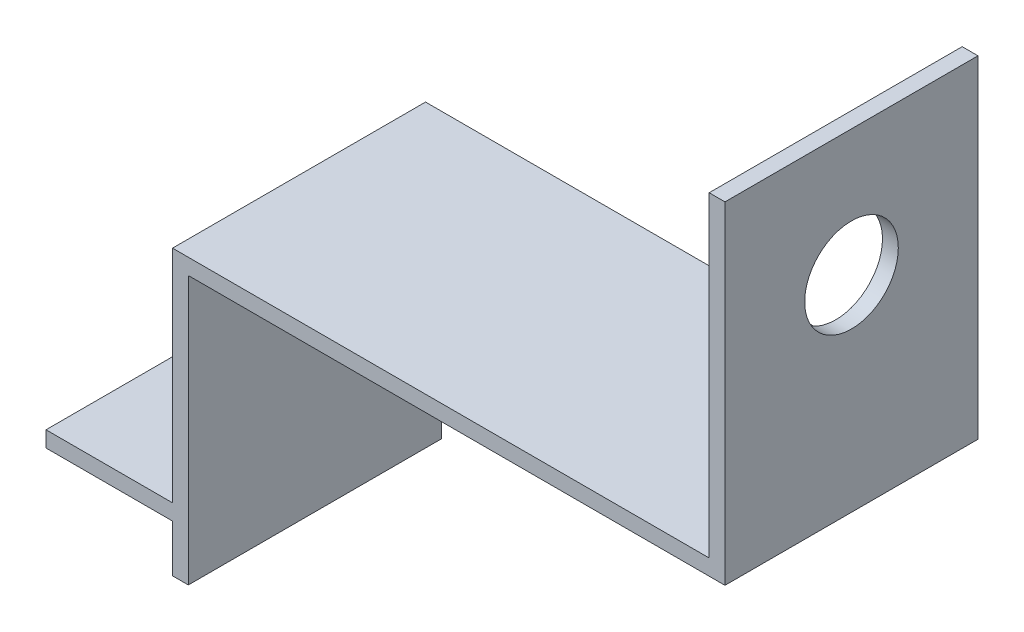
ISO-10303-21;
HEADER;
FILE_DESCRIPTION(('STEP AP214'),'2;1');
FILE_NAME('part.step','',(''),(''),'','','');
FILE_SCHEMA(('AUTOMOTIVE_DESIGN { 1 0 10303 214 1 1 1 1 }'));
ENDSEC;
DATA;
#1=APPLICATION_CONTEXT('core data for automotive mechanical design processes');
#2=APPLICATION_PROTOCOL_DEFINITION('international standard','automotive_design',2000,#1);
#3=PRODUCT_CONTEXT('',#1,'mechanical');
#4=PRODUCT('Part','Part','',(#3));
#5=PRODUCT_RELATED_PRODUCT_CATEGORY('part','',(#4));
#6=PRODUCT_DEFINITION_FORMATION('','',#4);
#7=PRODUCT_DEFINITION_CONTEXT('part definition',#1,'design');
#8=PRODUCT_DEFINITION('design','',#6,#7);
#9=PRODUCT_DEFINITION_SHAPE('','',#8);
#10=(LENGTH_UNIT() NAMED_UNIT(*) SI_UNIT(.MILLI.,.METRE.));
#11=(NAMED_UNIT(*) PLANE_ANGLE_UNIT() SI_UNIT($,.RADIAN.));
#12=(NAMED_UNIT(*) SI_UNIT($,.STERADIAN.) SOLID_ANGLE_UNIT());
#13=UNCERTAINTY_MEASURE_WITH_UNIT(LENGTH_MEASURE(1.E-05),#10,'distance_accuracy_value','');
#14=(GEOMETRIC_REPRESENTATION_CONTEXT(3) GLOBAL_UNCERTAINTY_ASSIGNED_CONTEXT((#13)) GLOBAL_UNIT_ASSIGNED_CONTEXT((#10,
#11,#12)) REPRESENTATION_CONTEXT('',''));
#15=CARTESIAN_POINT('',(0.,0.,0.));
#16=DIRECTION('',(0.,0.,1.));
#17=DIRECTION('',(1.,0.,0.));
#18=AXIS2_PLACEMENT_3D('',#15,#16,#17);
#19=CARTESIAN_POINT('',(0.,0.,-431.8));
#20=DIRECTION('',(1.,0.,0.));
#21=DIRECTION('',(0.,0.,-1.));
#22=AXIS2_PLACEMENT_3D('',#19,#20,#21);
#23=CYLINDRICAL_SURFACE('',#22,9.398);
#24=CARTESIAN_POINT('',(0.,0.,-431.8));
#25=DIRECTION('',(1.,0.,0.));
#26=DIRECTION('',(0.,0.,-1.));
#27=AXIS2_PLACEMENT_3D('',#24,#25,#26);
#28=CIRCLE('',#27,9.398);
#29=CARTESIAN_POINT('',(0.,0.,-441.198));
#30=VERTEX_POINT('',#29);
#31=EDGE_CURVE('E147',#30,#30,#28,.F.);
#32=ORIENTED_EDGE('',*,*,#31,.T.);
#33=EDGE_LOOP('',(#32));
#34=FACE_BOUND('',#33,.T.);
#35=CARTESIAN_POINT('',(3.175,0.,-431.8));
#36=DIRECTION('',(1.,0.,0.));
#37=DIRECTION('',(0.,0.,-1.));
#38=AXIS2_PLACEMENT_3D('',#35,#36,#37);
#39=CIRCLE('',#38,9.398);
#40=CARTESIAN_POINT('',(3.175,0.,-441.198));
#41=VERTEX_POINT('',#40);
#42=EDGE_CURVE('E20',#41,#41,#39,.F.);
#43=ORIENTED_EDGE('',*,*,#42,.F.);
#44=EDGE_LOOP('',(#43));
#45=FACE_BOUND('',#44,.T.);
#46=ADVANCED_FACE('F17',(#34,#45),#23,.F.);
#47=CARTESIAN_POINT('',(-52.28276564,-41.2749999999997,-431.8));
#48=DIRECTION('',(0.,-1.,0.));
#49=DIRECTION('',(0.,0.,-1.));
#50=AXIS2_PLACEMENT_3D('',#47,#48,#49);
#51=PLANE('',#50);
#52=DIRECTION('',(0.,0.,-1.));
#53=VECTOR('',#52,1.);
#54=CARTESIAN_POINT('',(3.175,-41.2749999999997,-215.9));
#55=LINE('',#54,#53);
#56=CARTESIAN_POINT('',(3.175,-41.2749999999997,-406.4));
#57=VERTEX_POINT('',#56);
#58=CARTESIAN_POINT('',(3.175,-41.2749999999997,-457.2));
#59=VERTEX_POINT('',#58);
#60=EDGE_CURVE('E103',#57,#59,#55,.T.);
#61=ORIENTED_EDGE('',*,*,#60,.F.);
#62=DIRECTION('',(1.,0.,0.));
#63=VECTOR('',#62,1.);
#64=CARTESIAN_POINT('',(3.175,-41.2749999999997,-406.4));
#65=LINE('',#64,#63);
#66=CARTESIAN_POINT('',(-104.56553128,-41.2749999999997,-406.4));
#67=VERTEX_POINT('',#66);
#68=EDGE_CURVE('E149',#67,#57,#65,.T.);
#69=ORIENTED_EDGE('',*,*,#68,.F.);
#70=DIRECTION('',(0.,0.,-1.));
#71=VECTOR('',#70,1.);
#72=CARTESIAN_POINT('',(-104.56553128,-41.2749999999997,-431.8));
#73=LINE('',#72,#71);
#74=CARTESIAN_POINT('',(-104.56553128,-41.2749999999997,-457.2));
#75=VERTEX_POINT('',#74);
#76=EDGE_CURVE('E137',#75,#67,#73,.F.);
#77=ORIENTED_EDGE('',*,*,#76,.F.);
#78=DIRECTION('',(-1.,0.,0.));
#79=VECTOR('',#78,1.);
#80=CARTESIAN_POINT('',(0.,-41.2749999999997,-457.2));
#81=LINE('',#80,#79);
#82=EDGE_CURVE('E128',#59,#75,#81,.T.);
#83=ORIENTED_EDGE('',*,*,#82,.F.);
#84=EDGE_LOOP('',(#61,#69,#77,#83));
#85=FACE_BOUND('',#84,.T.);
#86=ADVANCED_FACE('F240',(#85),#51,.T.);
#87=CARTESIAN_POINT('',(3.175,0.,-215.9));
#88=DIRECTION('',(1.,0.,0.));
#89=DIRECTION('',(0.,0.,-1.));
#90=AXIS2_PLACEMENT_3D('',#87,#88,#89);
#91=PLANE('',#90);
#92=ORIENTED_EDGE('',*,*,#42,.T.);
#93=EDGE_LOOP('',(#92));
#94=FACE_BOUND('',#93,.T.);
#95=DIRECTION('',(0.,1.,0.));
#96=VECTOR('',#95,1.);
#97=CARTESIAN_POINT('',(3.175,-25.3999999999998,-457.2));
#98=LINE('',#97,#96);
#99=CARTESIAN_POINT('',(3.175,25.4000000000002,-457.2));
#100=VERTEX_POINT('',#99);
#101=EDGE_CURVE('E121',#100,#59,#98,.F.);
#102=ORIENTED_EDGE('',*,*,#101,.F.);
#103=DIRECTION('',(0.,0.,1.));
#104=VECTOR('',#103,1.);
#105=CARTESIAN_POINT('',(3.175,25.4000000000003,-457.2));
#106=LINE('',#105,#104);
#107=CARTESIAN_POINT('',(3.175,25.4000000000002,-406.4));
#108=VERTEX_POINT('',#107);
#109=EDGE_CURVE('E109',#108,#100,#106,.F.);
#110=ORIENTED_EDGE('',*,*,#109,.F.);
#111=DIRECTION('',(0.,1.,0.));
#112=VECTOR('',#111,1.);
#113=CARTESIAN_POINT('',(3.175,25.4000000000003,-406.4));
#114=LINE('',#113,#112);
#115=EDGE_CURVE('E153',#57,#108,#114,.T.);
#116=ORIENTED_EDGE('',*,*,#115,.F.);
#117=ORIENTED_EDGE('',*,*,#60,.T.);
#118=EDGE_LOOP('',(#102,#110,#116,#117));
#119=FACE_BOUND('',#118,.T.);
#120=ADVANCED_FACE('F127',(#94,#119),#91,.T.);
#121=CARTESIAN_POINT('',(0.,25.4000000000003,-457.2));
#122=DIRECTION('',(0.,1.,0.));
#123=DIRECTION('',(0.,0.,1.));
#124=AXIS2_PLACEMENT_3D('',#121,#122,#123);
#125=PLANE('',#124);
#126=DIRECTION('',(-1.,0.,0.));
#127=VECTOR('',#126,1.);
#128=CARTESIAN_POINT('',(0.,25.4000000000002,-457.2));
#129=LINE('',#128,#127);
#130=CARTESIAN_POINT('',(0.,25.4000000000002,-457.2));
#131=VERTEX_POINT('',#130);
#132=EDGE_CURVE('E113',#131,#100,#129,.F.);
#133=ORIENTED_EDGE('',*,*,#132,.F.);
#134=DIRECTION('',(0.,0.,-1.));
#135=VECTOR('',#134,1.);
#136=CARTESIAN_POINT('',(0.,25.4000000000003,-215.9));
#137=LINE('',#136,#135);
#138=CARTESIAN_POINT('',(0.,25.4000000000002,-406.4));
#139=VERTEX_POINT('',#138);
#140=EDGE_CURVE('E150',#131,#139,#137,.F.);
#141=ORIENTED_EDGE('',*,*,#140,.T.);
#142=DIRECTION('',(1.,0.,0.));
#143=VECTOR('',#142,1.);
#144=CARTESIAN_POINT('',(3.175,25.4000000000003,-406.4));
#145=LINE('',#144,#143);
#146=EDGE_CURVE('E115',#108,#139,#145,.F.);
#147=ORIENTED_EDGE('',*,*,#146,.F.);
#148=ORIENTED_EDGE('',*,*,#109,.T.);
#149=EDGE_LOOP('',(#133,#141,#147,#148));
#150=FACE_BOUND('',#149,.T.);
#151=ADVANCED_FACE('F111',(#150),#125,.T.);
#152=CARTESIAN_POINT('',(-120.44053128,-82.3825951023997,-431.8));
#153=DIRECTION('',(0.,1.,0.));
#154=DIRECTION('',(0.,0.,1.));
#155=AXIS2_PLACEMENT_3D('',#152,#153,#154);
#156=PLANE('',#155);
#157=DIRECTION('',(-1.,0.,0.));
#158=VECTOR('',#157,1.);
#159=CARTESIAN_POINT('',(0.,-82.3825951023997,-457.2));
#160=LINE('',#159,#158);
#161=CARTESIAN_POINT('',(-133.14053128,-82.3825951023997,-457.2));
#162=VERTEX_POINT('',#161);
#163=CARTESIAN_POINT('',(-107.74053128,-82.3825951023997,-457.2));
#164=VERTEX_POINT('',#163);
#165=EDGE_CURVE('E161',#162,#164,#160,.F.);
#166=ORIENTED_EDGE('',*,*,#165,.F.);
#167=DIRECTION('',(0.,0.,1.));
#168=VECTOR('',#167,1.);
#169=CARTESIAN_POINT('',(-133.14053128,-82.3825951023997,-457.2));
#170=LINE('',#169,#168);
#171=CARTESIAN_POINT('',(-133.14053128,-82.3825951023997,-406.4));
#172=VERTEX_POINT('',#171);
#173=EDGE_CURVE('E116',#172,#162,#170,.F.);
#174=ORIENTED_EDGE('',*,*,#173,.F.);
#175=DIRECTION('',(1.,0.,0.));
#176=VECTOR('',#175,1.);
#177=CARTESIAN_POINT('',(3.175,-82.3825951023997,-406.4));
#178=LINE('',#177,#176);
#179=CARTESIAN_POINT('',(-107.74053128,-82.3825951023997,-406.4));
#180=VERTEX_POINT('',#179);
#181=EDGE_CURVE('E209',#180,#172,#178,.F.);
#182=ORIENTED_EDGE('',*,*,#181,.F.);
#183=DIRECTION('',(0.,0.,1.));
#184=VECTOR('',#183,1.);
#185=CARTESIAN_POINT('',(-107.74053128,-82.3825951023997,-406.4));
#186=LINE('',#185,#184);
#187=EDGE_CURVE('E125',#164,#180,#186,.T.);
#188=ORIENTED_EDGE('',*,*,#187,.F.);
#189=EDGE_LOOP('',(#166,#174,#182,#188));
#190=FACE_BOUND('',#189,.T.);
#191=ADVANCED_FACE('F206',(#190),#156,.T.);
#192=CARTESIAN_POINT('',(-133.14053128,-85.5575951023997,-457.2));
#193=DIRECTION('',(-1.,0.,0.));
#194=DIRECTION('',(0.,0.,1.));
#195=AXIS2_PLACEMENT_3D('',#192,#193,#194);
#196=PLANE('',#195);
#197=ORIENTED_EDGE('',*,*,#173,.T.);
#198=DIRECTION('',(0.,1.,0.));
#199=VECTOR('',#198,1.);
#200=CARTESIAN_POINT('',(-133.14053128,-25.3999999999998,-457.2));
#201=LINE('',#200,#199);
#202=CARTESIAN_POINT('',(-133.14053128,-85.5575951023997,-457.2));
#203=VERTEX_POINT('',#202);
#204=EDGE_CURVE('E163',#203,#162,#201,.T.);
#205=ORIENTED_EDGE('',*,*,#204,.F.);
#206=DIRECTION('',(0.,0.,1.));
#207=VECTOR('',#206,1.);
#208=CARTESIAN_POINT('',(-133.14053128,-85.5575951023997,-431.8));
#209=LINE('',#208,#207);
#210=CARTESIAN_POINT('',(-133.14053128,-85.5575951023997,-406.4));
#211=VERTEX_POINT('',#210);
#212=EDGE_CURVE('E143',#203,#211,#209,.T.);
#213=ORIENTED_EDGE('',*,*,#212,.T.);
#214=DIRECTION('',(0.,1.,0.));
#215=VECTOR('',#214,1.);
#216=CARTESIAN_POINT('',(-133.14053128,25.4000000000003,-406.4));
#217=LINE('',#216,#215);
#218=EDGE_CURVE('E201',#172,#211,#217,.F.);
#219=ORIENTED_EDGE('',*,*,#218,.F.);
#220=EDGE_LOOP('',(#197,#205,#213,#219));
#221=FACE_BOUND('',#220,.T.);
#222=ADVANCED_FACE('F200',(#221),#196,.T.);
#223=CARTESIAN_POINT('',(-120.44053128,-85.5575951023997,-431.8));
#224=DIRECTION('',(0.,1.,0.));
#225=DIRECTION('',(0.,0.,1.));
#226=AXIS2_PLACEMENT_3D('',#223,#224,#225);
#227=PLANE('',#226);
#228=ORIENTED_EDGE('',*,*,#212,.F.);
#229=DIRECTION('',(-1.,0.,0.));
#230=VECTOR('',#229,1.);
#231=CARTESIAN_POINT('',(0.,-85.5575951023997,-457.2));
#232=LINE('',#231,#230);
#233=CARTESIAN_POINT('',(-107.74053128,-85.5575951023997,-457.2));
#234=VERTEX_POINT('',#233);
#235=EDGE_CURVE('E166',#234,#203,#232,.T.);
#236=ORIENTED_EDGE('',*,*,#235,.F.);
#237=DIRECTION('',(0.,0.,1.));
#238=VECTOR('',#237,1.);
#239=CARTESIAN_POINT('',(-107.74053128,-85.5575951023997,-406.4));
#240=LINE('',#239,#238);
#241=CARTESIAN_POINT('',(-107.74053128,-85.5575951023997,-406.4));
#242=VERTEX_POINT('',#241);
#243=EDGE_CURVE('E141',#242,#234,#240,.F.);
#244=ORIENTED_EDGE('',*,*,#243,.F.);
#245=DIRECTION('',(1.,0.,0.));
#246=VECTOR('',#245,1.);
#247=CARTESIAN_POINT('',(3.175,-85.5575951023997,-406.4));
#248=LINE('',#247,#246);
#249=EDGE_CURVE('E197',#211,#242,#248,.T.);
#250=ORIENTED_EDGE('',*,*,#249,.F.);
#251=EDGE_LOOP('',(#228,#236,#244,#250));
#252=FACE_BOUND('',#251,.T.);
#253=ADVANCED_FACE('F195',(#252),#227,.F.);
#254=CARTESIAN_POINT('',(-107.74053128,-38.0999999999997,-406.4));
#255=DIRECTION('',(-1.,0.,0.));
#256=DIRECTION('',(0.,0.,1.));
#257=AXIS2_PLACEMENT_3D('',#254,#255,#256);
#258=PLANE('',#257);
#259=DIRECTION('',(0.,0.,-1.));
#260=VECTOR('',#259,1.);
#261=CARTESIAN_POINT('',(-107.74053128,-95.0825951023997,-406.4));
#262=LINE('',#261,#260);
#263=CARTESIAN_POINT('',(-107.74053128,-95.0825951023997,-406.4));
#264=VERTEX_POINT('',#263);
#265=CARTESIAN_POINT('',(-107.74053128,-95.0825951023997,-457.2));
#266=VERTEX_POINT('',#265);
#267=EDGE_CURVE('E139',#264,#266,#262,.T.);
#268=ORIENTED_EDGE('',*,*,#267,.F.);
#269=DIRECTION('',(0.,1.,0.));
#270=VECTOR('',#269,1.);
#271=CARTESIAN_POINT('',(-107.74053128,25.4000000000003,-406.4));
#272=LINE('',#271,#270);
#273=EDGE_CURVE('E190',#242,#264,#272,.F.);
#274=ORIENTED_EDGE('',*,*,#273,.F.);
#275=ORIENTED_EDGE('',*,*,#243,.T.);
#276=DIRECTION('',(0.,1.,0.));
#277=VECTOR('',#276,1.);
#278=CARTESIAN_POINT('',(-107.74053128,-25.3999999999998,-457.2));
#279=LINE('',#278,#277);
#280=EDGE_CURVE('E169',#266,#234,#279,.T.);
#281=ORIENTED_EDGE('',*,*,#280,.F.);
#282=EDGE_LOOP('',(#268,#274,#275,#281));
#283=FACE_BOUND('',#282,.T.);
#284=ADVANCED_FACE('F189',(#283),#258,.T.);
#285=CARTESIAN_POINT('',(-107.74053128,-95.0825951023997,-406.4));
#286=DIRECTION('',(0.,-1.,0.));
#287=DIRECTION('',(0.,0.,-1.));
#288=AXIS2_PLACEMENT_3D('',#285,#286,#287);
#289=PLANE('',#288);
#290=DIRECTION('',(0.,0.,-1.));
#291=VECTOR('',#290,1.);
#292=CARTESIAN_POINT('',(-104.56553128,-95.0825951023997,-431.8));
#293=LINE('',#292,#291);
#294=CARTESIAN_POINT('',(-104.56553128,-95.0825951023997,-406.4));
#295=VERTEX_POINT('',#294);
#296=CARTESIAN_POINT('',(-104.56553128,-95.0825951023997,-457.2));
#297=VERTEX_POINT('',#296);
#298=EDGE_CURVE('E135',#295,#297,#293,.T.);
#299=ORIENTED_EDGE('',*,*,#298,.F.);
#300=DIRECTION('',(1.,0.,0.));
#301=VECTOR('',#300,1.);
#302=CARTESIAN_POINT('',(3.175,-95.0825951023997,-406.4));
#303=LINE('',#302,#301);
#304=EDGE_CURVE('E186',#264,#295,#303,.T.);
#305=ORIENTED_EDGE('',*,*,#304,.F.);
#306=ORIENTED_EDGE('',*,*,#267,.T.);
#307=DIRECTION('',(-1.,0.,0.));
#308=VECTOR('',#307,1.);
#309=CARTESIAN_POINT('',(0.,-95.0825951023997,-457.2));
#310=LINE('',#309,#308);
#311=EDGE_CURVE('E172',#297,#266,#310,.T.);
#312=ORIENTED_EDGE('',*,*,#311,.F.);
#313=EDGE_LOOP('',(#299,#305,#306,#312));
#314=FACE_BOUND('',#313,.T.);
#315=ADVANCED_FACE('F182',(#314),#289,.T.);
#316=CARTESIAN_POINT('',(-104.56553128,-90.3200951023997,-431.8));
#317=DIRECTION('',(1.,0.,0.));
#318=DIRECTION('',(0.,0.,-1.));
#319=AXIS2_PLACEMENT_3D('',#316,#317,#318);
#320=PLANE('',#319);
#321=ORIENTED_EDGE('',*,*,#298,.T.);
#322=DIRECTION('',(0.,1.,0.));
#323=VECTOR('',#322,1.);
#324=CARTESIAN_POINT('',(-104.56553128,-25.3999999999998,-457.2));
#325=LINE('',#324,#323);
#326=EDGE_CURVE('E130',#75,#297,#325,.F.);
#327=ORIENTED_EDGE('',*,*,#326,.F.);
#328=ORIENTED_EDGE('',*,*,#76,.T.);
#329=DIRECTION('',(0.,1.,0.));
#330=VECTOR('',#329,1.);
#331=CARTESIAN_POINT('',(-104.56553128,25.4000000000003,-406.4));
#332=LINE('',#331,#330);
#333=EDGE_CURVE('E224',#295,#67,#332,.T.);
#334=ORIENTED_EDGE('',*,*,#333,.F.);
#335=EDGE_LOOP('',(#321,#327,#328,#334));
#336=FACE_BOUND('',#335,.T.);
#337=ADVANCED_FACE('F241',(#336),#320,.T.);
#338=CARTESIAN_POINT('',(-107.74053128,-38.0999999999997,-406.4));
#339=DIRECTION('',(-1.,0.,0.));
#340=DIRECTION('',(0.,0.,1.));
#341=AXIS2_PLACEMENT_3D('',#338,#339,#340);
#342=PLANE('',#341);
#343=DIRECTION('',(0.,0.,-1.));
#344=VECTOR('',#343,1.);
#345=CARTESIAN_POINT('',(-107.74053128,-38.0999999999997,-431.8));
#346=LINE('',#345,#344);
#347=CARTESIAN_POINT('',(-107.74053128,-38.0999999999997,-406.4));
#348=VERTEX_POINT('',#347);
#349=CARTESIAN_POINT('',(-107.74053128,-38.0999999999997,-457.2));
#350=VERTEX_POINT('',#349);
#351=EDGE_CURVE('E215',#348,#350,#346,.T.);
#352=ORIENTED_EDGE('',*,*,#351,.T.);
#353=DIRECTION('',(0.,1.,0.));
#354=VECTOR('',#353,1.);
#355=CARTESIAN_POINT('',(-107.74053128,-25.3999999999998,-457.2));
#356=LINE('',#355,#354);
#357=EDGE_CURVE('E156',#164,#350,#356,.T.);
#358=ORIENTED_EDGE('',*,*,#357,.F.);
#359=ORIENTED_EDGE('',*,*,#187,.T.);
#360=DIRECTION('',(0.,1.,0.));
#361=VECTOR('',#360,1.);
#362=CARTESIAN_POINT('',(-107.74053128,25.4000000000003,-406.4));
#363=LINE('',#362,#361);
#364=EDGE_CURVE('E234',#348,#180,#363,.F.);
#365=ORIENTED_EDGE('',*,*,#364,.F.);
#366=EDGE_LOOP('',(#352,#358,#359,#365));
#367=FACE_BOUND('',#366,.T.);
#368=ADVANCED_FACE('F214',(#367),#342,.T.);
#369=CARTESIAN_POINT('',(0.,-25.3999999999998,-457.2));
#370=DIRECTION('',(0.,0.,-1.));
#371=DIRECTION('',(-1.,0.,0.));
#372=AXIS2_PLACEMENT_3D('',#369,#370,#371);
#373=PLANE('',#372);
#374=ORIENTED_EDGE('',*,*,#165,.T.);
#375=ORIENTED_EDGE('',*,*,#357,.T.);
#376=DIRECTION('',(1.,0.,0.));
#377=VECTOR('',#376,1.);
#378=CARTESIAN_POINT('',(-52.28276564,-38.0999999999997,-457.2));
#379=LINE('',#378,#377);
#380=CARTESIAN_POINT('',(0.,-38.0999999999997,-457.2));
#381=VERTEX_POINT('',#380);
#382=EDGE_CURVE('E217',#350,#381,#379,.T.);
#383=ORIENTED_EDGE('',*,*,#382,.T.);
#384=DIRECTION('',(0.,1.,0.));
#385=VECTOR('',#384,1.);
#386=CARTESIAN_POINT('',(0.,0.,-457.2));
#387=LINE('',#386,#385);
#388=EDGE_CURVE('E124',#381,#131,#387,.T.);
#389=ORIENTED_EDGE('',*,*,#388,.T.);
#390=ORIENTED_EDGE('',*,*,#132,.T.);
#391=ORIENTED_EDGE('',*,*,#101,.T.);
#392=ORIENTED_EDGE('',*,*,#82,.T.);
#393=ORIENTED_EDGE('',*,*,#326,.T.);
#394=ORIENTED_EDGE('',*,*,#311,.T.);
#395=ORIENTED_EDGE('',*,*,#280,.T.);
#396=ORIENTED_EDGE('',*,*,#235,.T.);
#397=ORIENTED_EDGE('',*,*,#204,.T.);
#398=EDGE_LOOP('',(#374,#375,#383,#389,#390,#391,#392,#393,#394,#395,#396,#397));
#399=FACE_BOUND('',#398,.T.);
#400=ADVANCED_FACE('F120',(#399),#373,.T.);
#401=CARTESIAN_POINT('',(0.,0.,-215.9));
#402=DIRECTION('',(1.,0.,0.));
#403=DIRECTION('',(0.,0.,-1.));
#404=AXIS2_PLACEMENT_3D('',#401,#402,#403);
#405=PLANE('',#404);
#406=ORIENTED_EDGE('',*,*,#31,.F.);
#407=EDGE_LOOP('',(#406));
#408=FACE_BOUND('',#407,.T.);
#409=ORIENTED_EDGE('',*,*,#140,.F.);
#410=ORIENTED_EDGE('',*,*,#388,.F.);
#411=DIRECTION('',(0.,0.,-1.));
#412=VECTOR('',#411,1.);
#413=CARTESIAN_POINT('',(0.,-38.0999999999997,-431.8));
#414=LINE('',#413,#412);
#415=CARTESIAN_POINT('',(0.,-38.0999999999997,-406.4));
#416=VERTEX_POINT('',#415);
#417=EDGE_CURVE('E26',#381,#416,#414,.F.);
#418=ORIENTED_EDGE('',*,*,#417,.T.);
#419=DIRECTION('',(0.,1.,0.));
#420=VECTOR('',#419,1.);
#421=CARTESIAN_POINT('',(0.,25.4000000000003,-406.4));
#422=LINE('',#421,#420);
#423=EDGE_CURVE('E34',#139,#416,#422,.F.);
#424=ORIENTED_EDGE('',*,*,#423,.F.);
#425=EDGE_LOOP('',(#409,#410,#418,#424));
#426=FACE_BOUND('',#425,.T.);
#427=ADVANCED_FACE('F256',(#408,#426),#405,.F.);
#428=CARTESIAN_POINT('',(3.175,25.4000000000003,-406.4));
#429=DIRECTION('',(0.,0.,1.));
#430=DIRECTION('',(1.,0.,0.));
#431=AXIS2_PLACEMENT_3D('',#428,#429,#430);
#432=PLANE('',#431);
#433=ORIENTED_EDGE('',*,*,#304,.T.);
#434=ORIENTED_EDGE('',*,*,#333,.T.);
#435=ORIENTED_EDGE('',*,*,#68,.T.);
#436=ORIENTED_EDGE('',*,*,#115,.T.);
#437=ORIENTED_EDGE('',*,*,#146,.T.);
#438=ORIENTED_EDGE('',*,*,#423,.T.);
#439=DIRECTION('',(1.,0.,0.));
#440=VECTOR('',#439,1.);
#441=CARTESIAN_POINT('',(-52.28276564,-38.0999999999997,-406.4));
#442=LINE('',#441,#440);
#443=EDGE_CURVE('E11',#416,#348,#442,.F.);
#444=ORIENTED_EDGE('',*,*,#443,.T.);
#445=ORIENTED_EDGE('',*,*,#364,.T.);
#446=ORIENTED_EDGE('',*,*,#181,.T.);
#447=ORIENTED_EDGE('',*,*,#218,.T.);
#448=ORIENTED_EDGE('',*,*,#249,.T.);
#449=ORIENTED_EDGE('',*,*,#273,.T.);
#450=EDGE_LOOP('',(#433,#434,#435,#436,#437,#438,#444,#445,#446,#447,#448,#449));
#451=FACE_BOUND('',#450,.T.);
#452=ADVANCED_FACE('F237',(#451),#432,.T.);
#453=CARTESIAN_POINT('',(-52.28276564,-38.0999999999997,-431.8));
#454=DIRECTION('',(0.,-1.,0.));
#455=DIRECTION('',(0.,0.,-1.));
#456=AXIS2_PLACEMENT_3D('',#453,#454,#455);
#457=PLANE('',#456);
#458=ORIENTED_EDGE('',*,*,#417,.F.);
#459=ORIENTED_EDGE('',*,*,#382,.F.);
#460=ORIENTED_EDGE('',*,*,#351,.F.);
#461=ORIENTED_EDGE('',*,*,#443,.F.);
#462=EDGE_LOOP('',(#458,#459,#460,#461));
#463=FACE_BOUND('',#462,.T.);
#464=ADVANCED_FACE('F220',(#463),#457,.F.);
#465=CLOSED_SHELL('',(#46,#86,#120,#151,#191,#222,#253,#284,#315,#337,#368,#400,#427,#452,#464));
#466=MANIFOLD_SOLID_BREP('B1',#465);
#467=ADVANCED_BREP_SHAPE_REPRESENTATION('',(#18,#466),#14);
#468=SHAPE_DEFINITION_REPRESENTATION(#9,#467);
ENDSEC;
END-ISO-10303-21;
